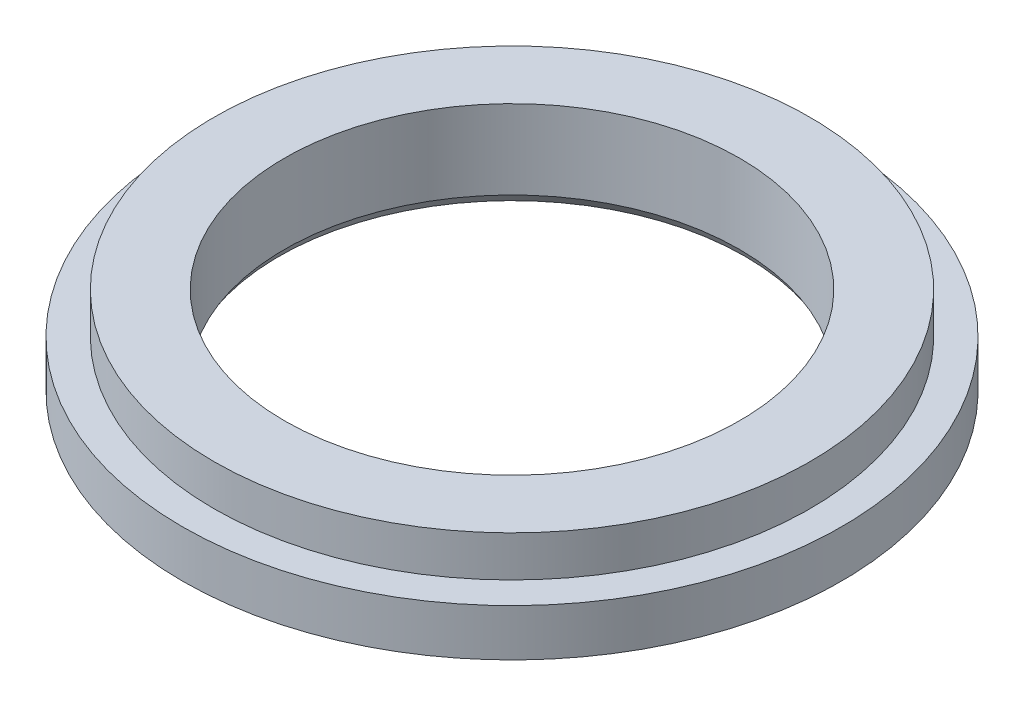
ISO-10303-21;
HEADER;
FILE_DESCRIPTION(('STEP AP214'),'2;1');
FILE_NAME('part.step','',(''),(''),'','','');
FILE_SCHEMA(('AUTOMOTIVE_DESIGN { 1 0 10303 214 1 1 1 1 }'));
ENDSEC;
DATA;
#1=APPLICATION_CONTEXT('core data for automotive mechanical design processes');
#2=APPLICATION_PROTOCOL_DEFINITION('international standard','automotive_design',2000,#1);
#3=PRODUCT_CONTEXT('',#1,'mechanical');
#4=PRODUCT('Part','Part','',(#3));
#5=PRODUCT_RELATED_PRODUCT_CATEGORY('part','',(#4));
#6=PRODUCT_DEFINITION_FORMATION('','',#4);
#7=PRODUCT_DEFINITION_CONTEXT('part definition',#1,'design');
#8=PRODUCT_DEFINITION('design','',#6,#7);
#9=PRODUCT_DEFINITION_SHAPE('','',#8);
#10=(LENGTH_UNIT() NAMED_UNIT(*) SI_UNIT(.MILLI.,.METRE.));
#11=(NAMED_UNIT(*) PLANE_ANGLE_UNIT() SI_UNIT($,.RADIAN.));
#12=(NAMED_UNIT(*) SI_UNIT($,.STERADIAN.) SOLID_ANGLE_UNIT());
#13=UNCERTAINTY_MEASURE_WITH_UNIT(LENGTH_MEASURE(1.E-05),#10,'distance_accuracy_value','');
#14=(GEOMETRIC_REPRESENTATION_CONTEXT(3) GLOBAL_UNCERTAINTY_ASSIGNED_CONTEXT((#13)) GLOBAL_UNIT_ASSIGNED_CONTEXT((#10,
#11,#12)) REPRESENTATION_CONTEXT('',''));
#15=CARTESIAN_POINT('',(0.,0.,0.));
#16=DIRECTION('',(0.,0.,1.));
#17=DIRECTION('',(1.,0.,0.));
#18=AXIS2_PLACEMENT_3D('',#15,#16,#17);
#19=CARTESIAN_POINT('',(0.,0.,0.));
#20=DIRECTION('',(0.,1.,0.));
#21=DIRECTION('',(0.,0.,1.));
#22=AXIS2_PLACEMENT_3D('',#19,#20,#21);
#23=CYLINDRICAL_SURFACE('',#22,46.0375);
#24=CARTESIAN_POINT('',(0.,1.77799999999996,0.));
#25=DIRECTION('',(0.,-1.,0.));
#26=DIRECTION('',(0.,0.,-1.));
#27=AXIS2_PLACEMENT_3D('',#24,#25,#26);
#28=CIRCLE('',#27,46.0375);
#29=CARTESIAN_POINT('',(0.,1.77799999999996,-46.0375));
#30=VERTEX_POINT('',#29);
#31=EDGE_CURVE('E11',#30,#30,#28,.T.);
#32=ORIENTED_EDGE('',*,*,#31,.T.);
#33=EDGE_LOOP('',(#32));
#34=FACE_BOUND('',#33,.T.);
#35=CARTESIAN_POINT('',(0.,17.78,0.));
#36=DIRECTION('',(0.,1.,0.));
#37=DIRECTION('',(0.,0.,1.));
#38=AXIS2_PLACEMENT_3D('',#35,#36,#37);
#39=CIRCLE('',#38,46.0375);
#40=CARTESIAN_POINT('',(0.,17.78,46.0375));
#41=VERTEX_POINT('',#40);
#42=EDGE_CURVE('E88',#41,#41,#39,.T.);
#43=ORIENTED_EDGE('',*,*,#42,.T.);
#44=EDGE_LOOP('',(#43));
#45=FACE_BOUND('',#44,.T.);
#46=ADVANCED_FACE('F34',(#34,#45),#23,.F.);
#47=CARTESIAN_POINT('',(-46.0375,0.,0.));
#48=DIRECTION('',(0.,-1.,0.));
#49=DIRECTION('',(0.,0.,-1.));
#50=AXIS2_PLACEMENT_3D('',#47,#48,#49);
#51=PLANE('',#50);
#52=CARTESIAN_POINT('',(-53.34,0.,5.58706843841678E-13));
#53=DIRECTION('',(0.,-1.,0.));
#54=DIRECTION('',(0.,0.,-1.));
#55=AXIS2_PLACEMENT_3D('',#52,#53,#54);
#56=CIRCLE('',#55,1.64999999999999);
#57=CARTESIAN_POINT('',(-53.34,0.,-1.64999999999943));
#58=VERTEX_POINT('',#57);
#59=EDGE_CURVE('E66',#58,#58,#56,.T.);
#60=ORIENTED_EDGE('',*,*,#59,.F.);
#61=EDGE_LOOP('',(#60));
#62=FACE_BOUND('',#61,.T.);
#63=CARTESIAN_POINT('',(0.,0.,-53.34));
#64=DIRECTION('',(0.,-1.,0.));
#65=DIRECTION('',(0.,0.,-1.));
#66=AXIS2_PLACEMENT_3D('',#63,#64,#65);
#67=CIRCLE('',#66,1.64999999999999);
#68=CARTESIAN_POINT('',(0.,0.,-54.99));
#69=VERTEX_POINT('',#68);
#70=EDGE_CURVE('E65',#69,#69,#67,.T.);
#71=ORIENTED_EDGE('',*,*,#70,.F.);
#72=EDGE_LOOP('',(#71));
#73=FACE_BOUND('',#72,.T.);
#74=CARTESIAN_POINT('',(53.34,0.,-1.86235614613893E-13));
#75=DIRECTION('',(0.,-1.,0.));
#76=DIRECTION('',(0.,0.,-1.));
#77=AXIS2_PLACEMENT_3D('',#74,#75,#76);
#78=CIRCLE('',#77,1.64999999999999);
#79=CARTESIAN_POINT('',(53.34,0.,-1.65000000000018));
#80=VERTEX_POINT('',#79);
#81=EDGE_CURVE('E76',#80,#80,#78,.T.);
#82=ORIENTED_EDGE('',*,*,#81,.F.);
#83=EDGE_LOOP('',(#82));
#84=FACE_BOUND('',#83,.T.);
#85=CARTESIAN_POINT('',(0.,0.,53.34));
#86=DIRECTION('',(0.,-1.,0.));
#87=DIRECTION('',(0.,0.,-1.));
#88=AXIS2_PLACEMENT_3D('',#85,#86,#87);
#89=CIRCLE('',#88,1.64999999999999);
#90=CARTESIAN_POINT('',(0.,0.,51.69));
#91=VERTEX_POINT('',#90);
#92=EDGE_CURVE('E82',#91,#91,#89,.T.);
#93=ORIENTED_EDGE('',*,*,#92,.F.);
#94=EDGE_LOOP('',(#93));
#95=FACE_BOUND('',#94,.T.);
#96=CARTESIAN_POINT('',(0.,0.,0.));
#97=DIRECTION('',(0.,-1.,0.));
#98=DIRECTION('',(0.,0.,-1.));
#99=AXIS2_PLACEMENT_3D('',#96,#97,#98);
#100=CIRCLE('',#99,47.1485177076948);
#101=CARTESIAN_POINT('',(0.,0.,-47.1485177076948));
#102=VERTEX_POINT('',#101);
#103=EDGE_CURVE('E42',#102,#102,#100,.F.);
#104=ORIENTED_EDGE('',*,*,#103,.T.);
#105=EDGE_LOOP('',(#104));
#106=FACE_BOUND('',#105,.T.);
#107=CARTESIAN_POINT('',(0.,0.,0.));
#108=DIRECTION('',(0.,1.,0.));
#109=DIRECTION('',(0.,0.,1.));
#110=AXIS2_PLACEMENT_3D('',#107,#108,#109);
#111=CIRCLE('',#110,66.675);
#112=CARTESIAN_POINT('',(0.,0.,66.675));
#113=VERTEX_POINT('',#112);
#114=EDGE_CURVE('E100',#113,#113,#111,.T.);
#115=ORIENTED_EDGE('',*,*,#114,.F.);
#116=EDGE_LOOP('',(#115));
#117=FACE_BOUND('',#116,.T.);
#118=ADVANCED_FACE('F105',(#62,#73,#84,#95,#106,#117),#51,.T.);
#119=CARTESIAN_POINT('',(0.,0.,0.));
#120=DIRECTION('',(0.,1.,0.));
#121=DIRECTION('',(0.,0.,1.));
#122=AXIS2_PLACEMENT_3D('',#119,#120,#121);
#123=CYLINDRICAL_SURFACE('',#122,66.675);
#124=ORIENTED_EDGE('',*,*,#114,.T.);
#125=EDGE_LOOP('',(#124));
#126=FACE_BOUND('',#125,.T.);
#127=CARTESIAN_POINT('',(0.,9.525,0.));
#128=DIRECTION('',(0.,1.,0.));
#129=DIRECTION('',(0.,0.,1.));
#130=AXIS2_PLACEMENT_3D('',#127,#128,#129);
#131=CIRCLE('',#130,66.675);
#132=CARTESIAN_POINT('',(0.,9.525,66.675));
#133=VERTEX_POINT('',#132);
#134=EDGE_CURVE('E97',#133,#133,#131,.T.);
#135=ORIENTED_EDGE('',*,*,#134,.F.);
#136=EDGE_LOOP('',(#135));
#137=FACE_BOUND('',#136,.T.);
#138=ADVANCED_FACE('F127',(#126,#137),#123,.T.);
#139=CARTESIAN_POINT('',(-66.675,9.525,0.));
#140=DIRECTION('',(0.,1.,0.));
#141=DIRECTION('',(0.,0.,1.));
#142=AXIS2_PLACEMENT_3D('',#139,#140,#141);
#143=PLANE('',#142);
#144=ORIENTED_EDGE('',*,*,#134,.T.);
#145=EDGE_LOOP('',(#144));
#146=FACE_BOUND('',#145,.T.);
#147=CARTESIAN_POINT('',(0.,9.525,0.));
#148=DIRECTION('',(0.,1.,0.));
#149=DIRECTION('',(0.,0.,1.));
#150=AXIS2_PLACEMENT_3D('',#147,#148,#149);
#151=CIRCLE('',#150,60.325);
#152=CARTESIAN_POINT('',(0.,9.525,60.325));
#153=VERTEX_POINT('',#152);
#154=EDGE_CURVE('E94',#153,#153,#151,.T.);
#155=ORIENTED_EDGE('',*,*,#154,.F.);
#156=EDGE_LOOP('',(#155));
#157=FACE_BOUND('',#156,.T.);
#158=ADVANCED_FACE('F134',(#146,#157),#143,.T.);
#159=CARTESIAN_POINT('',(0.,0.,0.));
#160=DIRECTION('',(0.,1.,0.));
#161=DIRECTION('',(0.,0.,1.));
#162=AXIS2_PLACEMENT_3D('',#159,#160,#161);
#163=CYLINDRICAL_SURFACE('',#162,60.325);
#164=ORIENTED_EDGE('',*,*,#154,.T.);
#165=EDGE_LOOP('',(#164));
#166=FACE_BOUND('',#165,.T.);
#167=CARTESIAN_POINT('',(0.,17.78,0.));
#168=DIRECTION('',(0.,1.,0.));
#169=DIRECTION('',(0.,0.,1.));
#170=AXIS2_PLACEMENT_3D('',#167,#168,#169);
#171=CIRCLE('',#170,60.325);
#172=CARTESIAN_POINT('',(0.,17.78,60.325));
#173=VERTEX_POINT('',#172);
#174=EDGE_CURVE('E91',#173,#173,#171,.T.);
#175=ORIENTED_EDGE('',*,*,#174,.F.);
#176=EDGE_LOOP('',(#175));
#177=FACE_BOUND('',#176,.T.);
#178=ADVANCED_FACE('F118',(#166,#177),#163,.T.);
#179=CARTESIAN_POINT('',(-60.325,17.78,0.));
#180=DIRECTION('',(0.,1.,0.));
#181=DIRECTION('',(0.,0.,1.));
#182=AXIS2_PLACEMENT_3D('',#179,#180,#181);
#183=PLANE('',#182);
#184=ORIENTED_EDGE('',*,*,#174,.T.);
#185=EDGE_LOOP('',(#184));
#186=FACE_BOUND('',#185,.T.);
#187=ORIENTED_EDGE('',*,*,#42,.F.);
#188=EDGE_LOOP('',(#187));
#189=FACE_BOUND('',#188,.T.);
#190=ADVANCED_FACE('F110',(#186,#189),#183,.T.);
#191=CARTESIAN_POINT('',(0.,0.,0.));
#192=DIRECTION('',(0.,-1.,0.));
#193=DIRECTION('',(0.,0.,-1.));
#194=AXIS2_PLACEMENT_3D('',#191,#192,#193);
#195=CONICAL_SURFACE('',#194,47.1485177076948,0.558505360638184);
#196=ORIENTED_EDGE('',*,*,#31,.F.);
#197=EDGE_LOOP('',(#196));
#198=FACE_BOUND('',#197,.T.);
#199=ORIENTED_EDGE('',*,*,#103,.F.);
#200=EDGE_LOOP('',(#199));
#201=FACE_BOUND('',#200,.T.);
#202=ADVANCED_FACE('F36',(#198,#201),#195,.F.);
#203=CARTESIAN_POINT('',(0.,11.62558,53.34));
#204=DIRECTION('',(0.,-1.,0.));
#205=DIRECTION('',(0.,0.,-1.));
#206=AXIS2_PLACEMENT_3D('',#203,#204,#205);
#207=CONICAL_SURFACE('',#206,1.64999999999999,1.02974425867665);
#208=CARTESIAN_POINT('',(0.,12.6170000213955,53.34));
#209=VERTEX_POINT('',#208);
#210=VERTEX_LOOP('',#209);
#211=FACE_BOUND('',#210,.T.);
#212=CARTESIAN_POINT('',(0.,11.62558,53.34));
#213=DIRECTION('',(0.,-1.,0.));
#214=DIRECTION('',(0.,0.,-1.));
#215=AXIS2_PLACEMENT_3D('',#212,#213,#214);
#216=CIRCLE('',#215,1.64999999999999);
#217=CARTESIAN_POINT('',(0.,11.62558,51.69));
#218=VERTEX_POINT('',#217);
#219=EDGE_CURVE('E85',#218,#218,#216,.T.);
#220=ORIENTED_EDGE('',*,*,#219,.T.);
#221=EDGE_LOOP('',(#220));
#222=FACE_BOUND('',#221,.T.);
#223=ADVANCED_FACE('F109',(#211,#222),#207,.F.);
#224=CARTESIAN_POINT('',(0.,0.,53.34));
#225=DIRECTION('',(0.,-1.,0.));
#226=DIRECTION('',(0.,0.,-1.));
#227=AXIS2_PLACEMENT_3D('',#224,#225,#226);
#228=CYLINDRICAL_SURFACE('',#227,1.64999999999999);
#229=ORIENTED_EDGE('',*,*,#219,.F.);
#230=EDGE_LOOP('',(#229));
#231=FACE_BOUND('',#230,.T.);
#232=ORIENTED_EDGE('',*,*,#92,.T.);
#233=EDGE_LOOP('',(#232));
#234=FACE_BOUND('',#233,.T.);
#235=ADVANCED_FACE('F116',(#231,#234),#228,.F.);
#236=CARTESIAN_POINT('',(53.34,11.62558,-1.86235614613893E-13));
#237=DIRECTION('',(0.,-1.,0.));
#238=DIRECTION('',(0.,0.,-1.));
#239=AXIS2_PLACEMENT_3D('',#236,#237,#238);
#240=CONICAL_SURFACE('',#239,1.64999999999998,1.02974425867665);
#241=CARTESIAN_POINT('',(53.34,12.6170000213955,-1.86235614613893E-13));
#242=VERTEX_POINT('',#241);
#243=VERTEX_LOOP('',#242);
#244=FACE_BOUND('',#243,.T.);
#245=CARTESIAN_POINT('',(53.34,11.62558,-1.86235614613893E-13));
#246=DIRECTION('',(0.,-1.,0.));
#247=DIRECTION('',(0.,0.,-1.));
#248=AXIS2_PLACEMENT_3D('',#245,#246,#247);
#249=CIRCLE('',#248,1.64999999999998);
#250=CARTESIAN_POINT('',(53.34,11.62558,-1.65000000000017));
#251=VERTEX_POINT('',#250);
#252=EDGE_CURVE('E79',#251,#251,#249,.T.);
#253=ORIENTED_EDGE('',*,*,#252,.T.);
#254=EDGE_LOOP('',(#253));
#255=FACE_BOUND('',#254,.T.);
#256=ADVANCED_FACE('F144',(#244,#255),#240,.F.);
#257=CARTESIAN_POINT('',(53.34,0.,-1.86235614613893E-13));
#258=DIRECTION('',(0.,-1.,0.));
#259=DIRECTION('',(0.,0.,-1.));
#260=AXIS2_PLACEMENT_3D('',#257,#258,#259);
#261=CYLINDRICAL_SURFACE('',#260,1.64999999999999);
#262=ORIENTED_EDGE('',*,*,#252,.F.);
#263=EDGE_LOOP('',(#262));
#264=FACE_BOUND('',#263,.T.);
#265=ORIENTED_EDGE('',*,*,#81,.T.);
#266=EDGE_LOOP('',(#265));
#267=FACE_BOUND('',#266,.T.);
#268=ADVANCED_FACE('F148',(#264,#267),#261,.F.);
#269=CARTESIAN_POINT('',(0.,11.62558,-53.34));
#270=DIRECTION('',(0.,-1.,0.));
#271=DIRECTION('',(0.,0.,-1.));
#272=AXIS2_PLACEMENT_3D('',#269,#270,#271);
#273=CONICAL_SURFACE('',#272,1.64999999999999,1.02974425867665);
#274=CARTESIAN_POINT('',(0.,12.6170000213955,-53.34));
#275=VERTEX_POINT('',#274);
#276=VERTEX_LOOP('',#275);
#277=FACE_BOUND('',#276,.T.);
#278=CARTESIAN_POINT('',(0.,11.62558,-53.34));
#279=DIRECTION('',(0.,-1.,0.));
#280=DIRECTION('',(0.,0.,-1.));
#281=AXIS2_PLACEMENT_3D('',#278,#279,#280);
#282=CIRCLE('',#281,1.64999999999999);
#283=CARTESIAN_POINT('',(0.,11.62558,-54.99));
#284=VERTEX_POINT('',#283);
#285=EDGE_CURVE('E69',#284,#284,#282,.T.);
#286=ORIENTED_EDGE('',*,*,#285,.T.);
#287=EDGE_LOOP('',(#286));
#288=FACE_BOUND('',#287,.T.);
#289=ADVANCED_FACE('F151',(#277,#288),#273,.F.);
#290=CARTESIAN_POINT('',(0.,0.,-53.34));
#291=DIRECTION('',(0.,-1.,0.));
#292=DIRECTION('',(0.,0.,-1.));
#293=AXIS2_PLACEMENT_3D('',#290,#291,#292);
#294=CYLINDRICAL_SURFACE('',#293,1.64999999999999);
#295=ORIENTED_EDGE('',*,*,#285,.F.);
#296=EDGE_LOOP('',(#295));
#297=FACE_BOUND('',#296,.T.);
#298=ORIENTED_EDGE('',*,*,#70,.T.);
#299=EDGE_LOOP('',(#298));
#300=FACE_BOUND('',#299,.T.);
#301=ADVANCED_FACE('F59',(#297,#300),#294,.F.);
#302=CARTESIAN_POINT('',(-53.34,11.62558,5.58706843841678E-13));
#303=DIRECTION('',(0.,-1.,0.));
#304=DIRECTION('',(0.,0.,-1.));
#305=AXIS2_PLACEMENT_3D('',#302,#303,#304);
#306=CONICAL_SURFACE('',#305,1.64999999999998,1.02974425867665);
#307=CARTESIAN_POINT('',(-53.34,12.6170000213955,5.58706843841678E-13));
#308=VERTEX_POINT('',#307);
#309=VERTEX_LOOP('',#308);
#310=FACE_BOUND('',#309,.T.);
#311=CARTESIAN_POINT('',(-53.34,11.62558,5.58706843841678E-13));
#312=DIRECTION('',(0.,-1.,0.));
#313=DIRECTION('',(0.,0.,-1.));
#314=AXIS2_PLACEMENT_3D('',#311,#312,#313);
#315=CIRCLE('',#314,1.64999999999998);
#316=CARTESIAN_POINT('',(-53.34,11.62558,-1.64999999999943));
#317=VERTEX_POINT('',#316);
#318=EDGE_CURVE('E63',#317,#317,#315,.T.);
#319=ORIENTED_EDGE('',*,*,#318,.T.);
#320=EDGE_LOOP('',(#319));
#321=FACE_BOUND('',#320,.T.);
#322=ADVANCED_FACE('F55',(#310,#321),#306,.F.);
#323=CARTESIAN_POINT('',(-53.34,0.,5.58706843841678E-13));
#324=DIRECTION('',(0.,-1.,0.));
#325=DIRECTION('',(0.,0.,-1.));
#326=AXIS2_PLACEMENT_3D('',#323,#324,#325);
#327=CYLINDRICAL_SURFACE('',#326,1.64999999999999);
#328=ORIENTED_EDGE('',*,*,#318,.F.);
#329=EDGE_LOOP('',(#328));
#330=FACE_BOUND('',#329,.T.);
#331=ORIENTED_EDGE('',*,*,#59,.T.);
#332=EDGE_LOOP('',(#331));
#333=FACE_BOUND('',#332,.T.);
#334=ADVANCED_FACE('F58',(#330,#333),#327,.F.);
#335=CLOSED_SHELL('',(#46,#118,#138,#158,#178,#190,#202,#223,#235,#256,#268,#289,#301,#322,#334));
#336=MANIFOLD_SOLID_BREP('B2',#335);
#337=ADVANCED_BREP_SHAPE_REPRESENTATION('',(#18,#336),#14);
#338=SHAPE_DEFINITION_REPRESENTATION(#9,#337);
ENDSEC;
END-ISO-10303-21;
